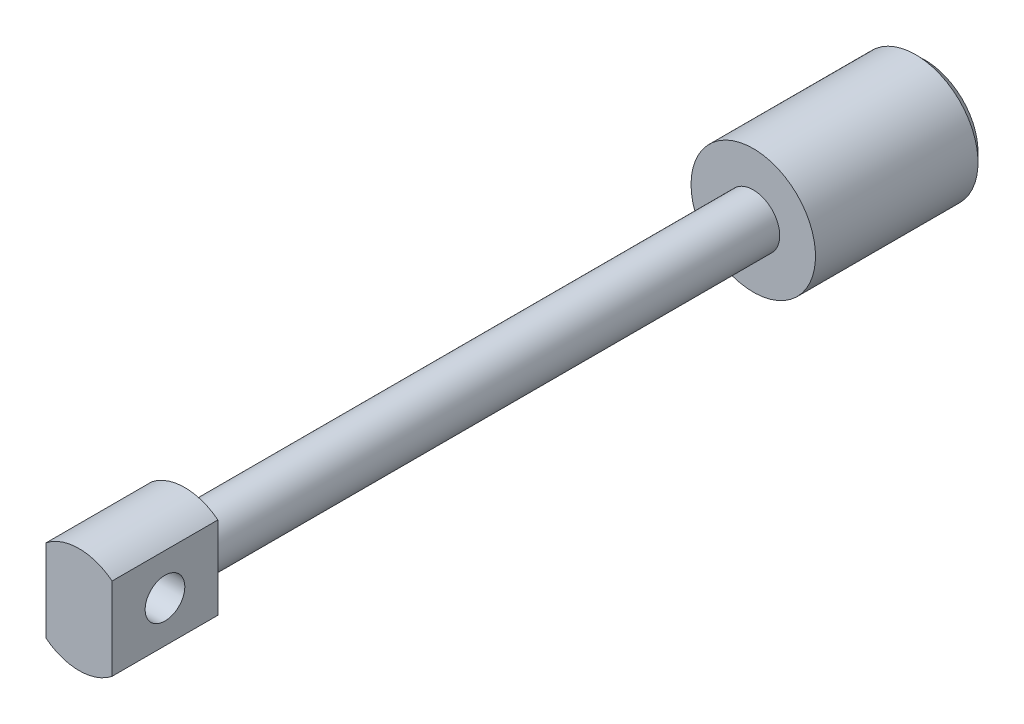
ISO-10303-21;
HEADER;
FILE_DESCRIPTION(('STEP AP214'),'2;1');
FILE_NAME('part.step','',(''),(''),'','','');
FILE_SCHEMA(('AUTOMOTIVE_DESIGN { 1 0 10303 214 1 1 1 1 }'));
ENDSEC;
DATA;
#1=APPLICATION_CONTEXT('core data for automotive mechanical design processes');
#2=APPLICATION_PROTOCOL_DEFINITION('international standard','automotive_design',2000,#1);
#3=PRODUCT_CONTEXT('',#1,'mechanical');
#4=PRODUCT('Part','Part','',(#3));
#5=PRODUCT_RELATED_PRODUCT_CATEGORY('part','',(#4));
#6=PRODUCT_DEFINITION_FORMATION('','',#4);
#7=PRODUCT_DEFINITION_CONTEXT('part definition',#1,'design');
#8=PRODUCT_DEFINITION('design','',#6,#7);
#9=PRODUCT_DEFINITION_SHAPE('','',#8);
#10=(LENGTH_UNIT() NAMED_UNIT(*) SI_UNIT(.MILLI.,.METRE.));
#11=(NAMED_UNIT(*) PLANE_ANGLE_UNIT() SI_UNIT($,.RADIAN.));
#12=(NAMED_UNIT(*) SI_UNIT($,.STERADIAN.) SOLID_ANGLE_UNIT());
#13=UNCERTAINTY_MEASURE_WITH_UNIT(LENGTH_MEASURE(1.E-05),#10,'distance_accuracy_value','');
#14=(GEOMETRIC_REPRESENTATION_CONTEXT(3) GLOBAL_UNCERTAINTY_ASSIGNED_CONTEXT((#13)) GLOBAL_UNIT_ASSIGNED_CONTEXT((#10,
#11,#12)) REPRESENTATION_CONTEXT('',''));
#15=CARTESIAN_POINT('',(0.,0.,0.));
#16=DIRECTION('',(0.,0.,1.));
#17=DIRECTION('',(1.,0.,0.));
#18=AXIS2_PLACEMENT_3D('',#15,#16,#17);
#19=CARTESIAN_POINT('',(0.,0.,-128.));
#20=DIRECTION('',(0.,0.,-1.));
#21=DIRECTION('',(-1.,0.,0.));
#22=AXIS2_PLACEMENT_3D('',#19,#20,#21);
#23=CYLINDRICAL_SURFACE('',#22,7.99999999999998);
#24=DIRECTION('',(0.,0.,-1.));
#25=VECTOR('',#24,1.);
#26=CARTESIAN_POINT('',(-5.,-6.24499799839838,-128.));
#27=LINE('',#26,#25);
#28=CARTESIAN_POINT('',(-5.,-6.24499799839838,0.));
#29=VERTEX_POINT('',#28);
#30=CARTESIAN_POINT('',(-5.,-6.24499799839838,-16.));
#31=VERTEX_POINT('',#30);
#32=EDGE_CURVE('E75',#29,#31,#27,.T.);
#33=ORIENTED_EDGE('',*,*,#32,.T.);
#34=CARTESIAN_POINT('',(0.,0.,-16.));
#35=DIRECTION('',(0.,0.,-1.));
#36=DIRECTION('',(-1.,0.,0.));
#37=AXIS2_PLACEMENT_3D('',#34,#35,#36);
#38=CIRCLE('',#37,7.99999999999998);
#39=CARTESIAN_POINT('',(5.,-6.24499799839838,-16.));
#40=VERTEX_POINT('',#39);
#41=EDGE_CURVE('E83',#40,#31,#38,.T.);
#42=ORIENTED_EDGE('',*,*,#41,.F.);
#43=DIRECTION('',(0.,0.,-1.));
#44=VECTOR('',#43,1.);
#45=CARTESIAN_POINT('',(5.,-6.24499799839838,-128.));
#46=LINE('',#45,#44);
#47=CARTESIAN_POINT('',(5.,-6.24499799839838,0.));
#48=VERTEX_POINT('',#47);
#49=EDGE_CURVE('E56',#40,#48,#46,.F.);
#50=ORIENTED_EDGE('',*,*,#49,.T.);
#51=CARTESIAN_POINT('',(0.,0.,0.));
#52=DIRECTION('',(0.,0.,-1.));
#53=DIRECTION('',(-1.,0.,0.));
#54=AXIS2_PLACEMENT_3D('',#51,#52,#53);
#55=CIRCLE('',#54,7.99999999999998);
#56=EDGE_CURVE('E11',#48,#29,#55,.T.);
#57=ORIENTED_EDGE('',*,*,#56,.T.);
#58=EDGE_LOOP('',(#33,#42,#50,#57));
#59=FACE_BOUND('',#58,.T.);
#60=ADVANCED_FACE('F33',(#59),#23,.T.);
#61=CARTESIAN_POINT('',(0.,0.,0.));
#62=DIRECTION('',(0.,0.,1.));
#63=DIRECTION('',(1.,0.,0.));
#64=AXIS2_PLACEMENT_3D('',#61,#62,#63);
#65=PLANE('',#64);
#66=DIRECTION('',(0.,1.,0.));
#67=VECTOR('',#66,1.);
#68=CARTESIAN_POINT('',(-5.,10.,0.));
#69=LINE('',#68,#67);
#70=CARTESIAN_POINT('',(-5.,6.24499799839838,0.));
#71=VERTEX_POINT('',#70);
#72=EDGE_CURVE('E85',#29,#71,#69,.T.);
#73=ORIENTED_EDGE('',*,*,#72,.F.);
#74=ORIENTED_EDGE('',*,*,#56,.F.);
#75=DIRECTION('',(0.,-1.,0.));
#76=VECTOR('',#75,1.);
#77=CARTESIAN_POINT('',(5.,-12.,0.));
#78=LINE('',#77,#76);
#79=CARTESIAN_POINT('',(5.,6.24499799839838,0.));
#80=VERTEX_POINT('',#79);
#81=EDGE_CURVE('E111',#80,#48,#78,.T.);
#82=ORIENTED_EDGE('',*,*,#81,.F.);
#83=EDGE_CURVE('E41',#71,#80,#55,.T.);
#84=ORIENTED_EDGE('',*,*,#83,.F.);
#85=EDGE_LOOP('',(#73,#74,#82,#84));
#86=FACE_BOUND('',#85,.T.);
#87=ADVANCED_FACE('F35',(#86),#65,.T.);
#88=DIRECTION('',(0.,0.,-1.));
#89=VECTOR('',#88,1.);
#90=CARTESIAN_POINT('',(-5.,6.24499799839838,-128.));
#91=LINE('',#90,#89);
#92=CARTESIAN_POINT('',(-5.,6.24499799839838,-16.));
#93=VERTEX_POINT('',#92);
#94=EDGE_CURVE('E48',#93,#71,#91,.F.);
#95=ORIENTED_EDGE('',*,*,#94,.T.);
#96=ORIENTED_EDGE('',*,*,#83,.T.);
#97=DIRECTION('',(0.,0.,-1.));
#98=VECTOR('',#97,1.);
#99=CARTESIAN_POINT('',(5.,6.24499799839838,-128.));
#100=LINE('',#99,#98);
#101=CARTESIAN_POINT('',(5.,6.24499799839838,-16.));
#102=VERTEX_POINT('',#101);
#103=EDGE_CURVE('E108',#80,#102,#100,.T.);
#104=ORIENTED_EDGE('',*,*,#103,.T.);
#105=EDGE_CURVE('E90',#93,#102,#38,.T.);
#106=ORIENTED_EDGE('',*,*,#105,.F.);
#107=EDGE_LOOP('',(#95,#96,#104,#106));
#108=FACE_BOUND('',#107,.T.);
#109=ADVANCED_FACE('F138',(#108),#23,.T.);
#110=CARTESIAN_POINT('',(-7.99999999999998,0.,-16.));
#111=DIRECTION('',(0.,0.,-1.));
#112=DIRECTION('',(-1.,0.,0.));
#113=AXIS2_PLACEMENT_3D('',#110,#111,#112);
#114=PLANE('',#113);
#115=DIRECTION('',(0.,1.,0.));
#116=VECTOR('',#115,1.);
#117=CARTESIAN_POINT('',(-5.,10.,-16.));
#118=LINE('',#117,#116);
#119=EDGE_CURVE('E72',#31,#93,#118,.T.);
#120=ORIENTED_EDGE('',*,*,#119,.T.);
#121=ORIENTED_EDGE('',*,*,#105,.T.);
#122=DIRECTION('',(0.,-1.,0.));
#123=VECTOR('',#122,1.);
#124=CARTESIAN_POINT('',(5.,-12.,-16.));
#125=LINE('',#124,#123);
#126=EDGE_CURVE('E89',#102,#40,#125,.T.);
#127=ORIENTED_EDGE('',*,*,#126,.T.);
#128=ORIENTED_EDGE('',*,*,#41,.T.);
#129=EDGE_LOOP('',(#120,#121,#127,#128));
#130=FACE_BOUND('',#129,.T.);
#131=CARTESIAN_POINT('',(0.,0.,-16.));
#132=DIRECTION('',(0.,0.,-1.));
#133=DIRECTION('',(-1.,0.,0.));
#134=AXIS2_PLACEMENT_3D('',#131,#132,#133);
#135=CIRCLE('',#134,3.99999999999999);
#136=CARTESIAN_POINT('',(-3.99999999999999,0.,-16.));
#137=VERTEX_POINT('',#136);
#138=EDGE_CURVE('E91',#137,#137,#135,.T.);
#139=ORIENTED_EDGE('',*,*,#138,.F.);
#140=EDGE_LOOP('',(#139));
#141=FACE_BOUND('',#140,.T.);
#142=ADVANCED_FACE('F87',(#130,#141),#114,.T.);
#143=CARTESIAN_POINT('',(0.,0.,-128.));
#144=DIRECTION('',(0.,0.,-1.));
#145=DIRECTION('',(-1.,0.,0.));
#146=AXIS2_PLACEMENT_3D('',#143,#144,#145);
#147=CYLINDRICAL_SURFACE('',#146,3.99999999999999);
#148=ORIENTED_EDGE('',*,*,#138,.T.);
#149=EDGE_LOOP('',(#148));
#150=FACE_BOUND('',#149,.T.);
#151=CARTESIAN_POINT('',(0.,0.,-102.));
#152=DIRECTION('',(0.,0.,-1.));
#153=DIRECTION('',(-1.,0.,0.));
#154=AXIS2_PLACEMENT_3D('',#151,#152,#153);
#155=CIRCLE('',#154,3.99999999999999);
#156=CARTESIAN_POINT('',(-3.99999999999999,0.,-102.));
#157=VERTEX_POINT('',#156);
#158=EDGE_CURVE('E95',#157,#157,#155,.T.);
#159=ORIENTED_EDGE('',*,*,#158,.F.);
#160=EDGE_LOOP('',(#159));
#161=FACE_BOUND('',#160,.T.);
#162=ADVANCED_FACE('F149',(#150,#161),#147,.T.);
#163=CARTESIAN_POINT('',(-3.99999999999999,0.,-102.));
#164=DIRECTION('',(0.,0.,1.));
#165=DIRECTION('',(1.,0.,0.));
#166=AXIS2_PLACEMENT_3D('',#163,#164,#165);
#167=PLANE('',#166);
#168=ORIENTED_EDGE('',*,*,#158,.T.);
#169=EDGE_LOOP('',(#168));
#170=FACE_BOUND('',#169,.T.);
#171=CARTESIAN_POINT('',(0.,0.,-102.));
#172=DIRECTION('',(0.,0.,-1.));
#173=DIRECTION('',(-1.,0.,0.));
#174=AXIS2_PLACEMENT_3D('',#171,#172,#173);
#175=CIRCLE('',#174,9.41421356237308);
#176=CARTESIAN_POINT('',(-9.41421356237307,0.,-102.));
#177=VERTEX_POINT('',#176);
#178=EDGE_CURVE('E98',#177,#177,#175,.T.);
#179=ORIENTED_EDGE('',*,*,#178,.F.);
#180=EDGE_LOOP('',(#179));
#181=FACE_BOUND('',#180,.T.);
#182=ADVANCED_FACE('F156',(#170,#181),#167,.T.);
#183=CARTESIAN_POINT('',(0.,0.,-128.));
#184=DIRECTION('',(0.,0.,-1.));
#185=DIRECTION('',(-1.,0.,0.));
#186=AXIS2_PLACEMENT_3D('',#183,#184,#185);
#187=CYLINDRICAL_SURFACE('',#186,9.41421356237307);
#188=ORIENTED_EDGE('',*,*,#178,.T.);
#189=EDGE_LOOP('',(#188));
#190=FACE_BOUND('',#189,.T.);
#191=CARTESIAN_POINT('',(0.,0.,-126.585786437627));
#192=DIRECTION('',(0.,0.,-1.));
#193=DIRECTION('',(-1.,0.,0.));
#194=AXIS2_PLACEMENT_3D('',#191,#192,#193);
#195=CIRCLE('',#194,9.41421356237307);
#196=CARTESIAN_POINT('',(-9.41421356237306,0.,-126.585786437627));
#197=VERTEX_POINT('',#196);
#198=EDGE_CURVE('E101',#197,#197,#195,.T.);
#199=ORIENTED_EDGE('',*,*,#198,.F.);
#200=EDGE_LOOP('',(#199));
#201=FACE_BOUND('',#200,.T.);
#202=ADVANCED_FACE('F162',(#190,#201),#187,.T.);
#203=CARTESIAN_POINT('',(0.,0.,-128.));
#204=DIRECTION('',(0.,0.,1.));
#205=DIRECTION('',(1.,0.,0.));
#206=AXIS2_PLACEMENT_3D('',#203,#204,#205);
#207=CONICAL_SURFACE('',#206,8.,0.785398163397429);
#208=ORIENTED_EDGE('',*,*,#198,.T.);
#209=EDGE_LOOP('',(#208));
#210=FACE_BOUND('',#209,.T.);
#211=CARTESIAN_POINT('',(0.,0.,-128.));
#212=DIRECTION('',(0.,0.,-1.));
#213=DIRECTION('',(-1.,0.,0.));
#214=AXIS2_PLACEMENT_3D('',#211,#212,#213);
#215=CIRCLE('',#214,8.);
#216=CARTESIAN_POINT('',(-8.,0.,-128.));
#217=VERTEX_POINT('',#216);
#218=EDGE_CURVE('E104',#217,#217,#215,.T.);
#219=ORIENTED_EDGE('',*,*,#218,.F.);
#220=EDGE_LOOP('',(#219));
#221=FACE_BOUND('',#220,.T.);
#222=ADVANCED_FACE('F166',(#210,#221),#207,.T.);
#223=CARTESIAN_POINT('',(-8.,0.,-128.));
#224=DIRECTION('',(0.,0.,-1.));
#225=DIRECTION('',(-1.,0.,0.));
#226=AXIS2_PLACEMENT_3D('',#223,#224,#225);
#227=PLANE('',#226);
#228=ORIENTED_EDGE('',*,*,#218,.T.);
#229=EDGE_LOOP('',(#228));
#230=FACE_BOUND('',#229,.T.);
#231=ADVANCED_FACE('F134',(#230),#227,.T.);
#232=CARTESIAN_POINT('',(5.,-12.,-128.001));
#233=DIRECTION('',(-1.,0.,0.));
#234=DIRECTION('',(0.,0.,1.));
#235=AXIS2_PLACEMENT_3D('',#232,#233,#234);
#236=PLANE('',#235);
#237=CARTESIAN_POINT('',(5.,0.,-8.));
#238=DIRECTION('',(-1.,0.,0.));
#239=DIRECTION('',(0.,0.,1.));
#240=AXIS2_PLACEMENT_3D('',#237,#238,#239);
#241=CIRCLE('',#240,3.);
#242=CARTESIAN_POINT('',(5.,0.,-5.));
#243=VERTEX_POINT('',#242);
#244=EDGE_CURVE('E116',#243,#243,#241,.F.);
#245=ORIENTED_EDGE('',*,*,#244,.F.);
#246=EDGE_LOOP('',(#245));
#247=FACE_BOUND('',#246,.T.);
#248=ORIENTED_EDGE('',*,*,#81,.T.);
#249=ORIENTED_EDGE('',*,*,#49,.F.);
#250=ORIENTED_EDGE('',*,*,#126,.F.);
#251=ORIENTED_EDGE('',*,*,#103,.F.);
#252=EDGE_LOOP('',(#248,#249,#250,#251));
#253=FACE_BOUND('',#252,.T.);
#254=ADVANCED_FACE('F127',(#247,#253),#236,.F.);
#255=CARTESIAN_POINT('',(-5.,10.,-128.001));
#256=DIRECTION('',(1.,0.,0.));
#257=DIRECTION('',(0.,1.,0.));
#258=AXIS2_PLACEMENT_3D('',#255,#256,#257);
#259=PLANE('',#258);
#260=CARTESIAN_POINT('',(-5.,0.,-8.));
#261=DIRECTION('',(-1.,0.,0.));
#262=DIRECTION('',(0.,-1.,0.));
#263=AXIS2_PLACEMENT_3D('',#260,#261,#262);
#264=CIRCLE('',#263,3.);
#265=CARTESIAN_POINT('',(-5.,-3.,-8.));
#266=VERTEX_POINT('',#265);
#267=EDGE_CURVE('E119',#266,#266,#264,.T.);
#268=ORIENTED_EDGE('',*,*,#267,.F.);
#269=EDGE_LOOP('',(#268));
#270=FACE_BOUND('',#269,.T.);
#271=ORIENTED_EDGE('',*,*,#72,.T.);
#272=ORIENTED_EDGE('',*,*,#94,.F.);
#273=ORIENTED_EDGE('',*,*,#119,.F.);
#274=ORIENTED_EDGE('',*,*,#32,.F.);
#275=EDGE_LOOP('',(#271,#272,#273,#274));
#276=FACE_BOUND('',#275,.T.);
#277=ADVANCED_FACE('F74',(#270,#276),#259,.F.);
#278=CARTESIAN_POINT('',(9.41521356237308,0.,-8.));
#279=DIRECTION('',(-1.,0.,0.));
#280=DIRECTION('',(0.,-1.,0.));
#281=AXIS2_PLACEMENT_3D('',#278,#279,#280);
#282=CYLINDRICAL_SURFACE('',#281,3.);
#283=ORIENTED_EDGE('',*,*,#267,.T.);
#284=EDGE_LOOP('',(#283));
#285=FACE_BOUND('',#284,.T.);
#286=ORIENTED_EDGE('',*,*,#244,.T.);
#287=EDGE_LOOP('',(#286));
#288=FACE_BOUND('',#287,.T.);
#289=ADVANCED_FACE('F123',(#285,#288),#282,.F.);
#290=CLOSED_SHELL('',(#60,#87,#109,#142,#162,#182,#202,#222,#231,#254,#277,#289));
#291=MANIFOLD_SOLID_BREP('B2',#290);
#292=ADVANCED_BREP_SHAPE_REPRESENTATION('',(#18,#291),#14);
#293=SHAPE_DEFINITION_REPRESENTATION(#9,#292);
ENDSEC;
END-ISO-10303-21;
